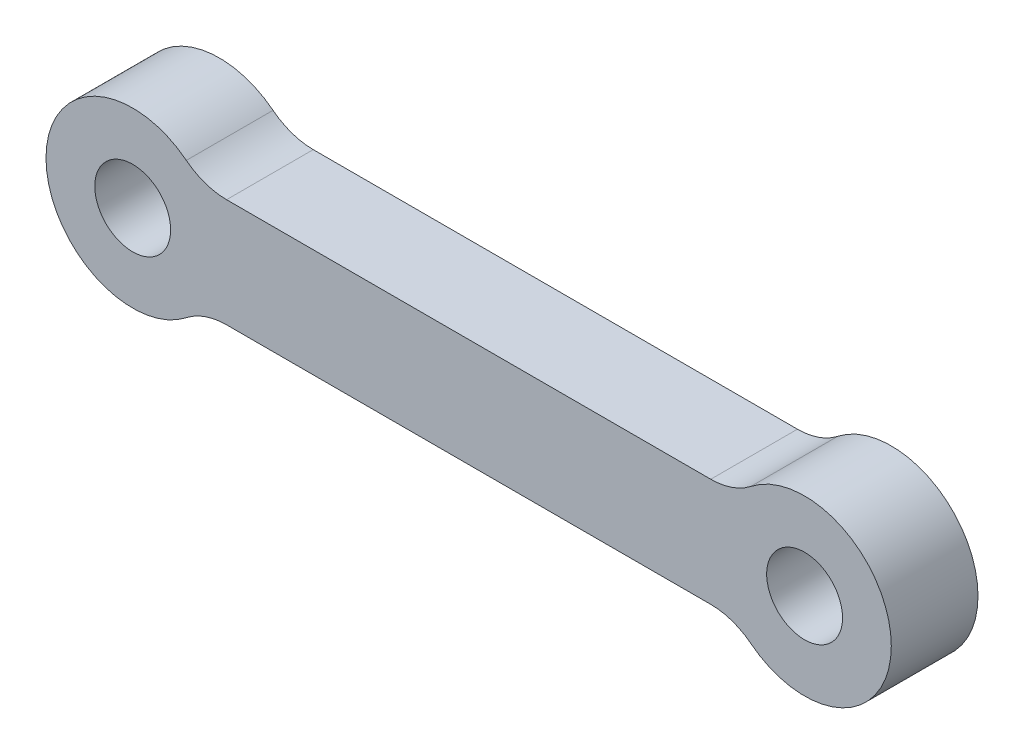
ISO-10303-21;
HEADER;
FILE_DESCRIPTION(('STEP AP214'),'2;1');
FILE_NAME('part.step','',(''),(''),'','','');
FILE_SCHEMA(('AUTOMOTIVE_DESIGN { 1 0 10303 214 1 1 1 1 }'));
ENDSEC;
DATA;
#1=APPLICATION_CONTEXT('core data for automotive mechanical design processes');
#2=APPLICATION_PROTOCOL_DEFINITION('international standard','automotive_design',2000,#1);
#3=PRODUCT_CONTEXT('',#1,'mechanical');
#4=PRODUCT('Part','Part','',(#3));
#5=PRODUCT_RELATED_PRODUCT_CATEGORY('part','',(#4));
#6=PRODUCT_DEFINITION_FORMATION('','',#4);
#7=PRODUCT_DEFINITION_CONTEXT('part definition',#1,'design');
#8=PRODUCT_DEFINITION('design','',#6,#7);
#9=PRODUCT_DEFINITION_SHAPE('','',#8);
#10=(LENGTH_UNIT() NAMED_UNIT(*) SI_UNIT(.MILLI.,.METRE.));
#11=(NAMED_UNIT(*) PLANE_ANGLE_UNIT() SI_UNIT($,.RADIAN.));
#12=(NAMED_UNIT(*) SI_UNIT($,.STERADIAN.) SOLID_ANGLE_UNIT());
#13=UNCERTAINTY_MEASURE_WITH_UNIT(LENGTH_MEASURE(1.E-05),#10,'distance_accuracy_value','');
#14=(GEOMETRIC_REPRESENTATION_CONTEXT(3) GLOBAL_UNCERTAINTY_ASSIGNED_CONTEXT((#13)) GLOBAL_UNIT_ASSIGNED_CONTEXT((#10,
#11,#12)) REPRESENTATION_CONTEXT('',''));
#15=CARTESIAN_POINT('',(0.,0.,0.));
#16=DIRECTION('',(0.,0.,1.));
#17=DIRECTION('',(1.,0.,0.));
#18=AXIS2_PLACEMENT_3D('',#15,#16,#17);
#19=CARTESIAN_POINT('',(0.,-2.50000000000001,2.));
#20=DIRECTION('',(0.,1.,0.));
#21=DIRECTION('',(-1.,0.,0.));
#22=AXIS2_PLACEMENT_3D('',#19,#20,#21);
#23=PLANE('',#22);
#24=DIRECTION('',(1.,0.,0.));
#25=VECTOR('',#24,1.);
#26=CARTESIAN_POINT('',(0.,-2.50000000000001,2.));
#27=LINE('',#26,#25);
#28=CARTESIAN_POINT('',(-11.1698729810778,-2.50000000000001,2.));
#29=VERTEX_POINT('',#28);
#30=CARTESIAN_POINT('',(11.1698729810778,-2.5,2.));
#31=VERTEX_POINT('',#30);
#32=EDGE_CURVE('E126',#29,#31,#27,.T.);
#33=ORIENTED_EDGE('',*,*,#32,.F.);
#34=DIRECTION('',(0.,0.,1.));
#35=VECTOR('',#34,1.);
#36=CARTESIAN_POINT('',(-11.1698729810778,-2.50000000000001,-2.));
#37=LINE('',#36,#35);
#38=CARTESIAN_POINT('',(-11.1698729810778,-2.50000000000001,-2.));
#39=VERTEX_POINT('',#38);
#40=EDGE_CURVE('E110',#29,#39,#37,.F.);
#41=ORIENTED_EDGE('',*,*,#40,.T.);
#42=DIRECTION('',(1.,0.,0.));
#43=VECTOR('',#42,1.);
#44=CARTESIAN_POINT('',(0.,-2.50000000000001,-2.));
#45=LINE('',#44,#43);
#46=CARTESIAN_POINT('',(11.1698729810778,-2.5,-2.));
#47=VERTEX_POINT('',#46);
#48=EDGE_CURVE('E123',#39,#47,#45,.T.);
#49=ORIENTED_EDGE('',*,*,#48,.T.);
#50=DIRECTION('',(0.,0.,1.));
#51=VECTOR('',#50,1.);
#52=CARTESIAN_POINT('',(11.1698729810778,-2.5,2.));
#53=LINE('',#52,#51);
#54=EDGE_CURVE('E129',#47,#31,#53,.T.);
#55=ORIENTED_EDGE('',*,*,#54,.T.);
#56=EDGE_LOOP('',(#33,#41,#49,#55));
#57=FACE_BOUND('',#56,.T.);
#58=ADVANCED_FACE('F39',(#57),#23,.F.);
#59=CARTESIAN_POINT('',(15.5,0.,2.));
#60=DIRECTION('',(0.,0.,-1.));
#61=DIRECTION('',(-1.,0.,0.));
#62=AXIS2_PLACEMENT_3D('',#59,#60,#61);
#63=CYLINDRICAL_SURFACE('',#62,4.);
#64=CARTESIAN_POINT('',(15.5,0.,2.));
#65=DIRECTION('',(0.,0.,1.));
#66=DIRECTION('',(1.,0.,0.));
#67=AXIS2_PLACEMENT_3D('',#64,#65,#66);
#68=CIRCLE('',#67,4.);
#69=CARTESIAN_POINT('',(13.025641703473,-3.14285714285714,2.));
#70=VERTEX_POINT('',#69);
#71=CARTESIAN_POINT('',(13.025641703473,3.14285714285715,2.));
#72=VERTEX_POINT('',#71);
#73=EDGE_CURVE('E210',#70,#72,#68,.T.);
#74=ORIENTED_EDGE('',*,*,#73,.F.);
#75=DIRECTION('',(0.,0.,-1.));
#76=VECTOR('',#75,1.);
#77=CARTESIAN_POINT('',(13.025641703473,-3.14285714285714,2.));
#78=LINE('',#77,#76);
#79=CARTESIAN_POINT('',(13.025641703473,-3.14285714285714,-2.));
#80=VERTEX_POINT('',#79);
#81=EDGE_CURVE('E170',#70,#80,#78,.T.);
#82=ORIENTED_EDGE('',*,*,#81,.T.);
#83=CARTESIAN_POINT('',(15.5,0.,-2.));
#84=DIRECTION('',(0.,0.,1.));
#85=DIRECTION('',(1.,0.,0.));
#86=AXIS2_PLACEMENT_3D('',#83,#84,#85);
#87=CIRCLE('',#86,4.);
#88=CARTESIAN_POINT('',(13.025641703473,3.14285714285715,-2.));
#89=VERTEX_POINT('',#88);
#90=EDGE_CURVE('E136',#80,#89,#87,.T.);
#91=ORIENTED_EDGE('',*,*,#90,.T.);
#92=DIRECTION('',(0.,0.,-1.));
#93=VECTOR('',#92,1.);
#94=CARTESIAN_POINT('',(13.025641703473,3.14285714285715,2.));
#95=LINE('',#94,#93);
#96=EDGE_CURVE('E167',#89,#72,#95,.F.);
#97=ORIENTED_EDGE('',*,*,#96,.T.);
#98=EDGE_LOOP('',(#74,#82,#91,#97));
#99=FACE_BOUND('',#98,.T.);
#100=ADVANCED_FACE('F222',(#99),#63,.T.);
#101=CARTESIAN_POINT('',(0.,2.5,2.));
#102=DIRECTION('',(0.,1.,0.));
#103=DIRECTION('',(-1.,0.,0.));
#104=AXIS2_PLACEMENT_3D('',#101,#102,#103);
#105=PLANE('',#104);
#106=DIRECTION('',(1.,0.,0.));
#107=VECTOR('',#106,1.);
#108=CARTESIAN_POINT('',(0.,2.5,2.));
#109=LINE('',#108,#107);
#110=CARTESIAN_POINT('',(-11.1698729810778,2.5,2.));
#111=VERTEX_POINT('',#110);
#112=CARTESIAN_POINT('',(11.1698729810778,2.5,2.));
#113=VERTEX_POINT('',#112);
#114=EDGE_CURVE('E201',#111,#113,#109,.T.);
#115=ORIENTED_EDGE('',*,*,#114,.T.);
#116=DIRECTION('',(0.,0.,-1.));
#117=VECTOR('',#116,1.);
#118=CARTESIAN_POINT('',(11.1698729810778,2.5,2.));
#119=LINE('',#118,#117);
#120=CARTESIAN_POINT('',(11.1698729810778,2.5,-2.));
#121=VERTEX_POINT('',#120);
#122=EDGE_CURVE('E118',#113,#121,#119,.T.);
#123=ORIENTED_EDGE('',*,*,#122,.T.);
#124=DIRECTION('',(1.,0.,0.));
#125=VECTOR('',#124,1.);
#126=CARTESIAN_POINT('',(0.,2.5,-2.));
#127=LINE('',#126,#125);
#128=CARTESIAN_POINT('',(-11.1698729810778,2.5,-2.));
#129=VERTEX_POINT('',#128);
#130=EDGE_CURVE('E140',#129,#121,#127,.T.);
#131=ORIENTED_EDGE('',*,*,#130,.F.);
#132=DIRECTION('',(0.,0.,-1.));
#133=VECTOR('',#132,1.);
#134=CARTESIAN_POINT('',(-11.1698729810778,2.5,2.));
#135=LINE('',#134,#133);
#136=EDGE_CURVE('E62',#129,#111,#135,.F.);
#137=ORIENTED_EDGE('',*,*,#136,.T.);
#138=EDGE_LOOP('',(#115,#123,#131,#137));
#139=FACE_BOUND('',#138,.T.);
#140=ADVANCED_FACE('F193',(#139),#105,.T.);
#141=CARTESIAN_POINT('',(-15.5,0.,2.));
#142=DIRECTION('',(0.,0.,-1.));
#143=DIRECTION('',(-1.,0.,0.));
#144=AXIS2_PLACEMENT_3D('',#141,#142,#143);
#145=CYLINDRICAL_SURFACE('',#144,1.75);
#146=CARTESIAN_POINT('',(-15.5,0.,2.));
#147=DIRECTION('',(0.,0.,1.));
#148=DIRECTION('',(1.,0.,0.));
#149=AXIS2_PLACEMENT_3D('',#146,#147,#148);
#150=CIRCLE('',#149,1.75);
#151=CARTESIAN_POINT('',(-13.75,0.,2.));
#152=VERTEX_POINT('',#151);
#153=EDGE_CURVE('E205',#152,#152,#150,.T.);
#154=ORIENTED_EDGE('',*,*,#153,.T.);
#155=EDGE_LOOP('',(#154));
#156=FACE_BOUND('',#155,.T.);
#157=CARTESIAN_POINT('',(-15.5,0.,-2.));
#158=DIRECTION('',(0.,0.,1.));
#159=DIRECTION('',(1.,0.,0.));
#160=AXIS2_PLACEMENT_3D('',#157,#158,#159);
#161=CIRCLE('',#160,1.75);
#162=CARTESIAN_POINT('',(-13.75,0.,-2.));
#163=VERTEX_POINT('',#162);
#164=EDGE_CURVE('E152',#163,#163,#161,.T.);
#165=ORIENTED_EDGE('',*,*,#164,.F.);
#166=EDGE_LOOP('',(#165));
#167=FACE_BOUND('',#166,.T.);
#168=ADVANCED_FACE('F254',(#156,#167),#145,.F.);
#169=CARTESIAN_POINT('',(-15.5,0.,2.));
#170=DIRECTION('',(0.,0.,-1.));
#171=DIRECTION('',(-1.,0.,0.));
#172=AXIS2_PLACEMENT_3D('',#169,#170,#171);
#173=CYLINDRICAL_SURFACE('',#172,4.);
#174=CARTESIAN_POINT('',(-15.5,0.,-2.));
#175=DIRECTION('',(0.,0.,1.));
#176=DIRECTION('',(1.,0.,0.));
#177=AXIS2_PLACEMENT_3D('',#174,#175,#176);
#178=CIRCLE('',#177,4.);
#179=CARTESIAN_POINT('',(-13.025641703473,3.14285714285714,-2.));
#180=VERTEX_POINT('',#179);
#181=CARTESIAN_POINT('',(-13.025641703473,-3.14285714285715,-2.));
#182=VERTEX_POINT('',#181);
#183=EDGE_CURVE('E149',#180,#182,#178,.T.);
#184=ORIENTED_EDGE('',*,*,#183,.T.);
#185=DIRECTION('',(0.,0.,-1.));
#186=VECTOR('',#185,1.);
#187=CARTESIAN_POINT('',(-13.025641703473,-3.14285714285715,2.));
#188=LINE('',#187,#186);
#189=CARTESIAN_POINT('',(-13.025641703473,-3.14285714285715,2.));
#190=VERTEX_POINT('',#189);
#191=EDGE_CURVE('E111',#182,#190,#188,.F.);
#192=ORIENTED_EDGE('',*,*,#191,.T.);
#193=CARTESIAN_POINT('',(-15.5,0.,2.));
#194=DIRECTION('',(0.,0.,1.));
#195=DIRECTION('',(1.,0.,0.));
#196=AXIS2_PLACEMENT_3D('',#193,#194,#195);
#197=CIRCLE('',#196,4.);
#198=CARTESIAN_POINT('',(-13.025641703473,3.14285714285714,2.));
#199=VERTEX_POINT('',#198);
#200=EDGE_CURVE('E200',#199,#190,#197,.T.);
#201=ORIENTED_EDGE('',*,*,#200,.F.);
#202=DIRECTION('',(0.,0.,-1.));
#203=VECTOR('',#202,1.);
#204=CARTESIAN_POINT('',(-13.025641703473,3.14285714285714,2.));
#205=LINE('',#204,#203);
#206=EDGE_CURVE('E128',#199,#180,#205,.T.);
#207=ORIENTED_EDGE('',*,*,#206,.T.);
#208=EDGE_LOOP('',(#184,#192,#201,#207));
#209=FACE_BOUND('',#208,.T.);
#210=ADVANCED_FACE('F203',(#209),#173,.T.);
#211=CARTESIAN_POINT('',(15.5,0.,2.));
#212=DIRECTION('',(0.,0.,-1.));
#213=DIRECTION('',(-1.,0.,0.));
#214=AXIS2_PLACEMENT_3D('',#211,#212,#213);
#215=CYLINDRICAL_SURFACE('',#214,1.75);
#216=CARTESIAN_POINT('',(15.5,0.,2.));
#217=DIRECTION('',(0.,0.,1.));
#218=DIRECTION('',(1.,0.,0.));
#219=AXIS2_PLACEMENT_3D('',#216,#217,#218);
#220=CIRCLE('',#219,1.75);
#221=CARTESIAN_POINT('',(17.25,0.,2.));
#222=VERTEX_POINT('',#221);
#223=EDGE_CURVE('E143',#222,#222,#220,.T.);
#224=ORIENTED_EDGE('',*,*,#223,.T.);
#225=EDGE_LOOP('',(#224));
#226=FACE_BOUND('',#225,.T.);
#227=CARTESIAN_POINT('',(15.5,0.,-2.));
#228=DIRECTION('',(0.,0.,1.));
#229=DIRECTION('',(1.,0.,0.));
#230=AXIS2_PLACEMENT_3D('',#227,#228,#229);
#231=CIRCLE('',#230,1.75);
#232=CARTESIAN_POINT('',(17.25,0.,-2.));
#233=VERTEX_POINT('',#232);
#234=EDGE_CURVE('E156',#233,#233,#231,.T.);
#235=ORIENTED_EDGE('',*,*,#234,.F.);
#236=EDGE_LOOP('',(#235));
#237=FACE_BOUND('',#236,.T.);
#238=ADVANCED_FACE('F248',(#226,#237),#215,.F.);
#239=CARTESIAN_POINT('',(0.,0.,2.));
#240=DIRECTION('',(0.,0.,1.));
#241=DIRECTION('',(1.,0.,0.));
#242=AXIS2_PLACEMENT_3D('',#239,#240,#241);
#243=PLANE('',#242);
#244=ORIENTED_EDGE('',*,*,#200,.T.);
#245=CARTESIAN_POINT('',(-11.1698729810778,-5.50000000000001,2.));
#246=DIRECTION('',(0.,0.,1.));
#247=DIRECTION('',(1.,0.,0.));
#248=AXIS2_PLACEMENT_3D('',#245,#246,#247);
#249=CIRCLE('',#248,3.);
#250=EDGE_CURVE('E117',#190,#29,#249,.F.);
#251=ORIENTED_EDGE('',*,*,#250,.T.);
#252=ORIENTED_EDGE('',*,*,#32,.T.);
#253=CARTESIAN_POINT('',(11.1698729810778,-5.50000000000001,2.));
#254=DIRECTION('',(0.,0.,1.));
#255=DIRECTION('',(1.,0.,0.));
#256=AXIS2_PLACEMENT_3D('',#253,#254,#255);
#257=CIRCLE('',#256,3.);
#258=EDGE_CURVE('E183',#31,#70,#257,.F.);
#259=ORIENTED_EDGE('',*,*,#258,.T.);
#260=ORIENTED_EDGE('',*,*,#73,.T.);
#261=CARTESIAN_POINT('',(11.1698729810778,5.5,2.));
#262=DIRECTION('',(0.,0.,1.));
#263=DIRECTION('',(1.,0.,0.));
#264=AXIS2_PLACEMENT_3D('',#261,#262,#263);
#265=CIRCLE('',#264,3.);
#266=EDGE_CURVE('E55',#72,#113,#265,.F.);
#267=ORIENTED_EDGE('',*,*,#266,.T.);
#268=ORIENTED_EDGE('',*,*,#114,.F.);
#269=CARTESIAN_POINT('',(-11.1698729810778,5.5,2.));
#270=DIRECTION('',(0.,0.,1.));
#271=DIRECTION('',(1.,0.,0.));
#272=AXIS2_PLACEMENT_3D('',#269,#270,#271);
#273=CIRCLE('',#272,3.);
#274=EDGE_CURVE('E11',#111,#199,#273,.F.);
#275=ORIENTED_EDGE('',*,*,#274,.T.);
#276=EDGE_LOOP('',(#244,#251,#252,#259,#260,#267,#268,#275));
#277=FACE_BOUND('',#276,.T.);
#278=ORIENTED_EDGE('',*,*,#153,.F.);
#279=EDGE_LOOP('',(#278));
#280=FACE_BOUND('',#279,.T.);
#281=ORIENTED_EDGE('',*,*,#223,.F.);
#282=EDGE_LOOP('',(#281));
#283=FACE_BOUND('',#282,.T.);
#284=ADVANCED_FACE('F198',(#277,#280,#283),#243,.T.);
#285=CARTESIAN_POINT('',(0.,0.,-2.));
#286=DIRECTION('',(0.,0.,1.));
#287=DIRECTION('',(1.,0.,0.));
#288=AXIS2_PLACEMENT_3D('',#285,#286,#287);
#289=PLANE('',#288);
#290=ORIENTED_EDGE('',*,*,#48,.F.);
#291=CARTESIAN_POINT('',(-11.1698729810778,-5.50000000000001,-2.));
#292=DIRECTION('',(0.,0.,1.));
#293=DIRECTION('',(1.,0.,0.));
#294=AXIS2_PLACEMENT_3D('',#291,#292,#293);
#295=CIRCLE('',#294,3.);
#296=EDGE_CURVE('E106',#39,#182,#295,.T.);
#297=ORIENTED_EDGE('',*,*,#296,.T.);
#298=ORIENTED_EDGE('',*,*,#183,.F.);
#299=CARTESIAN_POINT('',(-11.1698729810778,5.5,-2.));
#300=DIRECTION('',(0.,0.,1.));
#301=DIRECTION('',(1.,0.,0.));
#302=AXIS2_PLACEMENT_3D('',#299,#300,#301);
#303=CIRCLE('',#302,3.);
#304=EDGE_CURVE('E48',#180,#129,#303,.T.);
#305=ORIENTED_EDGE('',*,*,#304,.T.);
#306=ORIENTED_EDGE('',*,*,#130,.T.);
#307=CARTESIAN_POINT('',(11.1698729810778,5.5,-2.));
#308=DIRECTION('',(0.,0.,1.));
#309=DIRECTION('',(1.,0.,0.));
#310=AXIS2_PLACEMENT_3D('',#307,#308,#309);
#311=CIRCLE('',#310,3.);
#312=EDGE_CURVE('E186',#121,#89,#311,.T.);
#313=ORIENTED_EDGE('',*,*,#312,.T.);
#314=ORIENTED_EDGE('',*,*,#90,.F.);
#315=CARTESIAN_POINT('',(11.1698729810778,-5.50000000000001,-2.));
#316=DIRECTION('',(0.,0.,1.));
#317=DIRECTION('',(1.,0.,0.));
#318=AXIS2_PLACEMENT_3D('',#315,#316,#317);
#319=CIRCLE('',#318,3.);
#320=EDGE_CURVE('E134',#80,#47,#319,.T.);
#321=ORIENTED_EDGE('',*,*,#320,.T.);
#322=EDGE_LOOP('',(#290,#297,#298,#305,#306,#313,#314,#321));
#323=FACE_BOUND('',#322,.T.);
#324=ORIENTED_EDGE('',*,*,#164,.T.);
#325=EDGE_LOOP('',(#324));
#326=FACE_BOUND('',#325,.T.);
#327=ORIENTED_EDGE('',*,*,#234,.T.);
#328=EDGE_LOOP('',(#327));
#329=FACE_BOUND('',#328,.T.);
#330=ADVANCED_FACE('F131',(#323,#326,#329),#289,.F.);
#331=CARTESIAN_POINT('',(-11.1698729810778,-5.50000000000001,2.));
#332=DIRECTION('',(0.,0.,-1.));
#333=DIRECTION('',(-1.,0.,0.));
#334=AXIS2_PLACEMENT_3D('',#331,#332,#333);
#335=CYLINDRICAL_SURFACE('',#334,3.);
#336=ORIENTED_EDGE('',*,*,#250,.F.);
#337=ORIENTED_EDGE('',*,*,#191,.F.);
#338=ORIENTED_EDGE('',*,*,#296,.F.);
#339=ORIENTED_EDGE('',*,*,#40,.F.);
#340=EDGE_LOOP('',(#336,#337,#338,#339));
#341=FACE_BOUND('',#340,.T.);
#342=ADVANCED_FACE('F109',(#341),#335,.F.);
#343=CARTESIAN_POINT('',(11.1698729810778,-5.50000000000001,2.));
#344=DIRECTION('',(0.,0.,-1.));
#345=DIRECTION('',(-1.,0.,0.));
#346=AXIS2_PLACEMENT_3D('',#343,#344,#345);
#347=CYLINDRICAL_SURFACE('',#346,3.);
#348=ORIENTED_EDGE('',*,*,#258,.F.);
#349=ORIENTED_EDGE('',*,*,#54,.F.);
#350=ORIENTED_EDGE('',*,*,#320,.F.);
#351=ORIENTED_EDGE('',*,*,#81,.F.);
#352=EDGE_LOOP('',(#348,#349,#350,#351));
#353=FACE_BOUND('',#352,.T.);
#354=ADVANCED_FACE('F220',(#353),#347,.F.);
#355=CARTESIAN_POINT('',(11.1698729810778,5.5,2.));
#356=DIRECTION('',(0.,0.,-1.));
#357=DIRECTION('',(-1.,0.,0.));
#358=AXIS2_PLACEMENT_3D('',#355,#356,#357);
#359=CYLINDRICAL_SURFACE('',#358,3.);
#360=ORIENTED_EDGE('',*,*,#266,.F.);
#361=ORIENTED_EDGE('',*,*,#96,.F.);
#362=ORIENTED_EDGE('',*,*,#312,.F.);
#363=ORIENTED_EDGE('',*,*,#122,.F.);
#364=EDGE_LOOP('',(#360,#361,#362,#363));
#365=FACE_BOUND('',#364,.T.);
#366=ADVANCED_FACE('F225',(#365),#359,.F.);
#367=CARTESIAN_POINT('',(-11.1698729810778,5.5,2.));
#368=DIRECTION('',(0.,0.,-1.));
#369=DIRECTION('',(-1.,0.,0.));
#370=AXIS2_PLACEMENT_3D('',#367,#368,#369);
#371=CYLINDRICAL_SURFACE('',#370,3.);
#372=ORIENTED_EDGE('',*,*,#274,.F.);
#373=ORIENTED_EDGE('',*,*,#136,.F.);
#374=ORIENTED_EDGE('',*,*,#304,.F.);
#375=ORIENTED_EDGE('',*,*,#206,.F.);
#376=EDGE_LOOP('',(#372,#373,#374,#375));
#377=FACE_BOUND('',#376,.T.);
#378=ADVANCED_FACE('F41',(#377),#371,.F.);
#379=CLOSED_SHELL('',(#58,#100,#140,#168,#210,#238,#284,#330,#342,#354,#366,#378));
#380=MANIFOLD_SOLID_BREP('B2',#379);
#381=ADVANCED_BREP_SHAPE_REPRESENTATION('',(#18,#380),#14);
#382=SHAPE_DEFINITION_REPRESENTATION(#9,#381);
ENDSEC;
END-ISO-10303-21;
